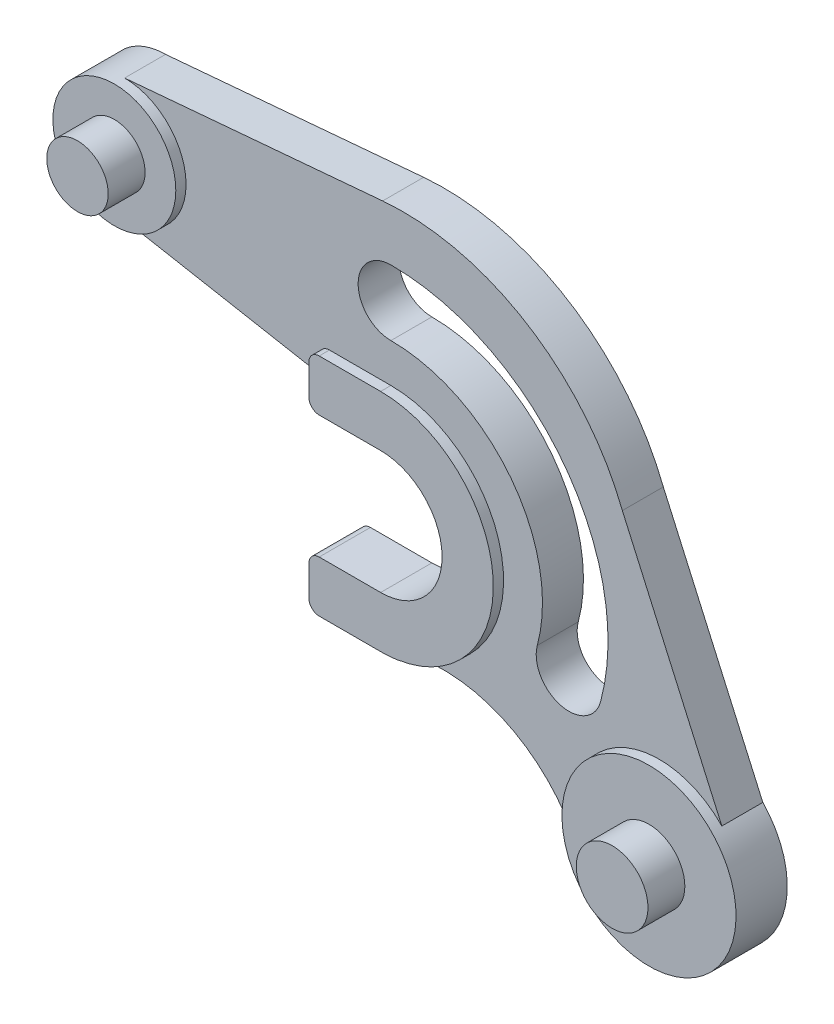
ISO-10303-21;
HEADER;
FILE_DESCRIPTION(('STEP AP214'),'2;1');
FILE_NAME('part.step','',(''),(''),'','','');
FILE_SCHEMA(('AUTOMOTIVE_DESIGN { 1 0 10303 214 1 1 1 1 }'));
ENDSEC;
DATA;
#1=APPLICATION_CONTEXT('core data for automotive mechanical design processes');
#2=APPLICATION_PROTOCOL_DEFINITION('international standard','automotive_design',2000,#1);
#3=PRODUCT_CONTEXT('',#1,'mechanical');
#4=PRODUCT('Part','Part','',(#3));
#5=PRODUCT_RELATED_PRODUCT_CATEGORY('part','',(#4));
#6=PRODUCT_DEFINITION_FORMATION('','',#4);
#7=PRODUCT_DEFINITION_CONTEXT('part definition',#1,'design');
#8=PRODUCT_DEFINITION('design','',#6,#7);
#9=PRODUCT_DEFINITION_SHAPE('','',#8);
#10=(LENGTH_UNIT() NAMED_UNIT(*) SI_UNIT(.MILLI.,.METRE.));
#11=(NAMED_UNIT(*) PLANE_ANGLE_UNIT() SI_UNIT($,.RADIAN.));
#12=(NAMED_UNIT(*) SI_UNIT($,.STERADIAN.) SOLID_ANGLE_UNIT());
#13=UNCERTAINTY_MEASURE_WITH_UNIT(LENGTH_MEASURE(1.E-05),#10,'distance_accuracy_value','');
#14=(GEOMETRIC_REPRESENTATION_CONTEXT(3) GLOBAL_UNCERTAINTY_ASSIGNED_CONTEXT((#13)) GLOBAL_UNIT_ASSIGNED_CONTEXT((#10,
#11,#12)) REPRESENTATION_CONTEXT('',''));
#15=CARTESIAN_POINT('',(0.,0.,0.));
#16=DIRECTION('',(0.,0.,1.));
#17=DIRECTION('',(1.,0.,0.));
#18=AXIS2_PLACEMENT_3D('',#15,#16,#17);
#19=CARTESIAN_POINT('',(0.,90.,20.));
#20=DIRECTION('',(0.,0.,-1.));
#21=DIRECTION('',(-1.,0.,0.));
#22=AXIS2_PLACEMENT_3D('',#19,#20,#21);
#23=CYLINDRICAL_SURFACE('',#22,16.);
#24=CARTESIAN_POINT('',(0.,90.,0.));
#25=DIRECTION('',(0.,0.,1.));
#26=DIRECTION('',(1.,0.,0.));
#27=AXIS2_PLACEMENT_3D('',#24,#25,#26);
#28=CIRCLE('',#27,16.);
#29=CARTESIAN_POINT('',(0.,106.,0.));
#30=VERTEX_POINT('',#29);
#31=CARTESIAN_POINT('',(0.,74.,0.));
#32=VERTEX_POINT('',#31);
#33=EDGE_CURVE('E175',#30,#32,#28,.T.);
#34=ORIENTED_EDGE('',*,*,#33,.F.);
#35=DIRECTION('',(0.,0.,-1.));
#36=VECTOR('',#35,1.);
#37=CARTESIAN_POINT('',(0.,106.,20.));
#38=LINE('',#37,#36);
#39=CARTESIAN_POINT('',(0.,106.,20.));
#40=VERTEX_POINT('',#39);
#41=EDGE_CURVE('E11',#40,#30,#38,.T.);
#42=ORIENTED_EDGE('',*,*,#41,.F.);
#43=CARTESIAN_POINT('',(0.,90.,20.));
#44=DIRECTION('',(0.,0.,1.));
#45=DIRECTION('',(1.,0.,0.));
#46=AXIS2_PLACEMENT_3D('',#43,#44,#45);
#47=CIRCLE('',#46,16.);
#48=CARTESIAN_POINT('',(0.,74.,20.));
#49=VERTEX_POINT('',#48);
#50=EDGE_CURVE('E143',#40,#49,#47,.T.);
#51=ORIENTED_EDGE('',*,*,#50,.T.);
#52=DIRECTION('',(0.,0.,-1.));
#53=VECTOR('',#52,1.);
#54=CARTESIAN_POINT('',(0.,74.,20.));
#55=LINE('',#54,#53);
#56=EDGE_CURVE('E96',#49,#32,#55,.T.);
#57=ORIENTED_EDGE('',*,*,#56,.T.);
#58=EDGE_LOOP('',(#34,#42,#51,#57));
#59=FACE_BOUND('',#58,.T.);
#60=ADVANCED_FACE('F41',(#59),#23,.F.);
#61=CARTESIAN_POINT('',(0.,0.,20.));
#62=DIRECTION('',(0.,0.,-1.));
#63=DIRECTION('',(-1.,0.,0.));
#64=AXIS2_PLACEMENT_3D('',#61,#62,#63);
#65=CYLINDRICAL_SURFACE('',#64,106.);
#66=CARTESIAN_POINT('',(0.,0.,0.));
#67=DIRECTION('',(0.,0.,1.));
#68=DIRECTION('',(1.,0.,0.));
#69=AXIS2_PLACEMENT_3D('',#66,#67,#68);
#70=CIRCLE('',#69,106.);
#71=CARTESIAN_POINT('',(102.386743402509,-27.4400214181548,0.));
#72=VERTEX_POINT('',#71);
#73=EDGE_CURVE('E134',#72,#30,#70,.T.);
#74=ORIENTED_EDGE('',*,*,#73,.F.);
#75=DIRECTION('',(0.,0.,-1.));
#76=VECTOR('',#75,1.);
#77=CARTESIAN_POINT('',(102.386743402509,-27.4400214181548,20.));
#78=LINE('',#77,#76);
#79=CARTESIAN_POINT('',(102.386743402509,-27.4400214181548,20.));
#80=VERTEX_POINT('',#79);
#81=EDGE_CURVE('E52',#80,#72,#78,.T.);
#82=ORIENTED_EDGE('',*,*,#81,.F.);
#83=CARTESIAN_POINT('',(0.,0.,20.));
#84=DIRECTION('',(0.,0.,1.));
#85=DIRECTION('',(1.,0.,0.));
#86=AXIS2_PLACEMENT_3D('',#83,#84,#85);
#87=CIRCLE('',#86,106.);
#88=EDGE_CURVE('E132',#80,#40,#87,.T.);
#89=ORIENTED_EDGE('',*,*,#88,.T.);
#90=ORIENTED_EDGE('',*,*,#41,.T.);
#91=EDGE_LOOP('',(#74,#82,#89,#90));
#92=FACE_BOUND('',#91,.T.);
#93=ADVANCED_FACE('F131',(#92),#65,.F.);
#94=CARTESIAN_POINT('',(86.9321406247717,-23.298131392773,20.));
#95=DIRECTION('',(0.,0.,-1.));
#96=DIRECTION('',(-1.,0.,0.));
#97=AXIS2_PLACEMENT_3D('',#94,#95,#96);
#98=CYLINDRICAL_SURFACE('',#97,16.);
#99=CARTESIAN_POINT('',(86.9321406247717,-23.298131392773,0.));
#100=DIRECTION('',(0.,0.,1.));
#101=DIRECTION('',(1.,0.,0.));
#102=AXIS2_PLACEMENT_3D('',#99,#100,#101);
#103=CIRCLE('',#102,16.);
#104=CARTESIAN_POINT('',(71.4775378470345,-19.1562413673911,0.));
#105=VERTEX_POINT('',#104);
#106=EDGE_CURVE('E181',#105,#72,#103,.T.);
#107=ORIENTED_EDGE('',*,*,#106,.F.);
#108=DIRECTION('',(0.,0.,-1.));
#109=VECTOR('',#108,1.);
#110=CARTESIAN_POINT('',(71.4775378470345,-19.1562413673911,20.));
#111=LINE('',#110,#109);
#112=CARTESIAN_POINT('',(71.4775378470345,-19.1562413673911,20.));
#113=VERTEX_POINT('',#112);
#114=EDGE_CURVE('E89',#113,#105,#111,.T.);
#115=ORIENTED_EDGE('',*,*,#114,.F.);
#116=CARTESIAN_POINT('',(86.9321406247717,-23.298131392773,20.));
#117=DIRECTION('',(0.,0.,1.));
#118=DIRECTION('',(1.,0.,0.));
#119=AXIS2_PLACEMENT_3D('',#116,#117,#118);
#120=CIRCLE('',#119,16.);
#121=EDGE_CURVE('E142',#113,#80,#120,.T.);
#122=ORIENTED_EDGE('',*,*,#121,.T.);
#123=ORIENTED_EDGE('',*,*,#81,.T.);
#124=EDGE_LOOP('',(#107,#115,#122,#123));
#125=FACE_BOUND('',#124,.T.);
#126=ADVANCED_FACE('F146',(#125),#98,.F.);
#127=CARTESIAN_POINT('',(25.4217830189074,-124.309898693249,20.));
#128=DIRECTION('',(0.,0.,-1.));
#129=DIRECTION('',(-1.,0.,0.));
#130=AXIS2_PLACEMENT_3D('',#127,#128,#129);
#131=CYLINDRICAL_SURFACE('',#130,72.);
#132=CARTESIAN_POINT('',(25.4217830189074,-124.309898693249,0.));
#133=DIRECTION('',(0.,0.,1.));
#134=DIRECTION('',(1.,0.,0.));
#135=AXIS2_PLACEMENT_3D('',#132,#133,#134);
#136=CIRCLE('',#135,72.);
#137=CARTESIAN_POINT('',(8.35707200090222,-54.3613773516799,0.));
#138=VERTEX_POINT('',#137);
#139=CARTESIAN_POINT('',(91.8772702313844,-96.6030724702352,0.));
#140=VERTEX_POINT('',#139);
#141=EDGE_CURVE('E154',#138,#140,#136,.F.);
#142=ORIENTED_EDGE('',*,*,#141,.T.);
#143=DIRECTION('',(0.,0.,-1.));
#144=VECTOR('',#143,1.);
#145=CARTESIAN_POINT('',(91.8772702313844,-96.6030724702352,25.));
#146=LINE('',#145,#144);
#147=CARTESIAN_POINT('',(91.8772702313844,-96.6030724702352,25.));
#148=VERTEX_POINT('',#147);
#149=EDGE_CURVE('E299',#148,#140,#146,.T.);
#150=ORIENTED_EDGE('',*,*,#149,.F.);
#151=CARTESIAN_POINT('',(25.4217830189074,-124.309898693249,25.));
#152=DIRECTION('',(0.,0.,1.));
#153=DIRECTION('',(1.,0.,0.));
#154=AXIS2_PLACEMENT_3D('',#151,#152,#153);
#155=CIRCLE('',#154,72.);
#156=CARTESIAN_POINT('',(91.7461426252189,-96.2906317004694,25.));
#157=VERTEX_POINT('',#156);
#158=EDGE_CURVE('E316',#157,#148,#155,.F.);
#159=ORIENTED_EDGE('',*,*,#158,.F.);
#160=DIRECTION('',(0.,0.,-1.));
#161=VECTOR('',#160,1.);
#162=CARTESIAN_POINT('',(91.7461426252189,-96.2906317004694,25.));
#163=LINE('',#162,#161);
#164=CARTESIAN_POINT('',(91.7461426252189,-96.2906317004694,20.));
#165=VERTEX_POINT('',#164);
#166=EDGE_CURVE('E315',#157,#165,#163,.T.);
#167=ORIENTED_EDGE('',*,*,#166,.T.);
#168=CARTESIAN_POINT('',(25.4217830189074,-124.309898693249,20.));
#169=DIRECTION('',(0.,0.,1.));
#170=DIRECTION('',(1.,0.,0.));
#171=AXIS2_PLACEMENT_3D('',#168,#169,#170);
#172=CIRCLE('',#171,72.);
#173=CARTESIAN_POINT('',(13.6555001074386,-53.2778313824404,20.));
#174=VERTEX_POINT('',#173);
#175=EDGE_CURVE('E345',#174,#165,#172,.F.);
#176=ORIENTED_EDGE('',*,*,#175,.F.);
#177=DIRECTION('',(0.,0.,-1.));
#178=VECTOR('',#177,1.);
#179=CARTESIAN_POINT('',(13.6555001074386,-53.2778313824404,25.));
#180=LINE('',#179,#178);
#181=CARTESIAN_POINT('',(13.6555001074386,-53.2778313824404,25.));
#182=VERTEX_POINT('',#181);
#183=EDGE_CURVE('E364',#182,#174,#180,.T.);
#184=ORIENTED_EDGE('',*,*,#183,.F.);
#185=CARTESIAN_POINT('',(25.4217830189074,-124.309898693249,25.));
#186=DIRECTION('',(0.,0.,1.));
#187=DIRECTION('',(1.,0.,0.));
#188=AXIS2_PLACEMENT_3D('',#185,#186,#187);
#189=CIRCLE('',#188,72.);
#190=CARTESIAN_POINT('',(8.35707200090222,-54.3613773516799,25.));
#191=VERTEX_POINT('',#190);
#192=EDGE_CURVE('E378',#191,#182,#189,.F.);
#193=ORIENTED_EDGE('',*,*,#192,.F.);
#194=DIRECTION('',(0.,0.,-1.));
#195=VECTOR('',#194,1.);
#196=CARTESIAN_POINT('',(8.35707200090222,-54.3613773516799,25.));
#197=LINE('',#196,#195);
#198=EDGE_CURVE('E304',#191,#138,#197,.T.);
#199=ORIENTED_EDGE('',*,*,#198,.T.);
#200=EDGE_LOOP('',(#142,#150,#159,#167,#176,#184,#193,#199));
#201=FACE_BOUND('',#200,.T.);
#202=ADVANCED_FACE('F43',(#201),#131,.F.);
#203=CARTESIAN_POINT('',(116.083477945521,51.6836942717257,20.));
#204=DIRECTION('',(0.913545457642605,0.406736643075792,0.));
#205=DIRECTION('',(-0.406736643075792,0.913545457642605,0.));
#206=AXIS2_PLACEMENT_3D('',#203,#204,#205);
#207=PLANE('',#206);
#208=DIRECTION('',(0.406736643075792,-0.913545457642605,0.));
#209=VECTOR('',#208,1.);
#210=CARTESIAN_POINT('',(116.083477945521,51.6836942717257,0.));
#211=LINE('',#210,#209);
#212=CARTESIAN_POINT('',(112.99328610824,58.6243787766777,0.));
#213=VERTEX_POINT('',#212);
#214=CARTESIAN_POINT('',(161.565293977531,-50.4701370801163,0.));
#215=VERTEX_POINT('',#214);
#216=EDGE_CURVE('E158',#213,#215,#211,.T.);
#217=ORIENTED_EDGE('',*,*,#216,.F.);
#218=DIRECTION('',(0.,0.,-1.));
#219=VECTOR('',#218,1.);
#220=CARTESIAN_POINT('',(112.99328610824,58.6243787766777,20.));
#221=LINE('',#220,#219);
#222=CARTESIAN_POINT('',(112.99328610824,58.6243787766777,20.));
#223=VERTEX_POINT('',#222);
#224=EDGE_CURVE('E204',#223,#213,#221,.T.);
#225=ORIENTED_EDGE('',*,*,#224,.F.);
#226=DIRECTION('',(0.406736643075792,-0.913545457642605,0.));
#227=VECTOR('',#226,1.);
#228=CARTESIAN_POINT('',(116.083477945521,51.6836942717257,20.));
#229=LINE('',#228,#227);
#230=CARTESIAN_POINT('',(161.565293977531,-50.4701370801163,20.));
#231=VERTEX_POINT('',#230);
#232=EDGE_CURVE('E219',#223,#231,#229,.T.);
#233=ORIENTED_EDGE('',*,*,#232,.T.);
#234=DIRECTION('',(0.,0.,-1.));
#235=VECTOR('',#234,1.);
#236=CARTESIAN_POINT('',(161.565293977531,-50.4701370801163,20.));
#237=LINE('',#236,#235);
#238=EDGE_CURVE('E45',#231,#215,#237,.T.);
#239=ORIENTED_EDGE('',*,*,#238,.T.);
#240=EDGE_LOOP('',(#217,#225,#233,#239));
#241=FACE_BOUND('',#240,.T.);
#242=ADVANCED_FACE('F216',(#241),#207,.T.);
#243=CARTESIAN_POINT('',(6.00211201037575,16.459361699005,20.));
#244=DIRECTION('',(0.,0.,-1.));
#245=DIRECTION('',(-1.,0.,0.));
#246=AXIS2_PLACEMENT_3D('',#243,#244,#245);
#247=CYLINDRICAL_SURFACE('',#246,115.);
#248=CARTESIAN_POINT('',(6.00211201037575,16.459361699005,0.));
#249=DIRECTION('',(0.,0.,1.));
#250=DIRECTION('',(1.,0.,0.));
#251=AXIS2_PLACEMENT_3D('',#248,#249,#250);
#252=CIRCLE('',#251,115.);
#253=CARTESIAN_POINT('',(-4.0207984056042,131.021751979556,0.));
#254=VERTEX_POINT('',#253);
#255=EDGE_CURVE('E163',#254,#213,#252,.F.);
#256=ORIENTED_EDGE('',*,*,#255,.F.);
#257=DIRECTION('',(0.,0.,-1.));
#258=VECTOR('',#257,1.);
#259=CARTESIAN_POINT('',(-4.0207984056042,131.021751979556,20.));
#260=LINE('',#259,#258);
#261=CARTESIAN_POINT('',(-4.0207984056042,131.021751979556,20.));
#262=VERTEX_POINT('',#261);
#263=EDGE_CURVE('E202',#262,#254,#260,.T.);
#264=ORIENTED_EDGE('',*,*,#263,.F.);
#265=CARTESIAN_POINT('',(6.00211201037575,16.459361699005,20.));
#266=DIRECTION('',(0.,0.,1.));
#267=DIRECTION('',(1.,0.,0.));
#268=AXIS2_PLACEMENT_3D('',#265,#266,#267);
#269=CIRCLE('',#268,115.);
#270=EDGE_CURVE('E237',#262,#223,#269,.F.);
#271=ORIENTED_EDGE('',*,*,#270,.T.);
#272=ORIENTED_EDGE('',*,*,#224,.T.);
#273=EDGE_LOOP('',(#256,#264,#271,#272));
#274=FACE_BOUND('',#273,.T.);
#275=ADVANCED_FACE('F235',(#274),#247,.T.);
#276=CARTESIAN_POINT('',(-11.4063867142214,130.375596729082,20.));
#277=DIRECTION('',(-0.0871557427476516,0.996194698091746,0.));
#278=DIRECTION('',(-0.996194698091746,-0.0871557427476516,0.));
#279=AXIS2_PLACEMENT_3D('',#276,#277,#278);
#280=PLANE('',#279);
#281=DIRECTION('',(0.996194698091746,0.0871557427476516,0.));
#282=VECTOR('',#281,1.);
#283=CARTESIAN_POINT('',(-11.4063867142214,130.375596729082,0.));
#284=LINE('',#283,#282);
#285=CARTESIAN_POINT('',(-130.,120.,0.));
#286=VERTEX_POINT('',#285);
#287=EDGE_CURVE('E167',#286,#254,#284,.T.);
#288=ORIENTED_EDGE('',*,*,#287,.F.);
#289=DIRECTION('',(0.,0.,-1.));
#290=VECTOR('',#289,1.);
#291=CARTESIAN_POINT('',(-130.,120.,20.));
#292=LINE('',#291,#290);
#293=CARTESIAN_POINT('',(-130.,120.,20.));
#294=VERTEX_POINT('',#293);
#295=EDGE_CURVE('E198',#294,#286,#292,.T.);
#296=ORIENTED_EDGE('',*,*,#295,.F.);
#297=DIRECTION('',(0.996194698091746,0.0871557427476516,0.));
#298=VECTOR('',#297,1.);
#299=CARTESIAN_POINT('',(-11.4063867142214,130.375596729082,20.));
#300=LINE('',#299,#298);
#301=EDGE_CURVE('E243',#294,#262,#300,.T.);
#302=ORIENTED_EDGE('',*,*,#301,.T.);
#303=ORIENTED_EDGE('',*,*,#263,.T.);
#304=EDGE_LOOP('',(#288,#296,#302,#303));
#305=FACE_BOUND('',#304,.T.);
#306=ADVANCED_FACE('F247',(#305),#280,.T.);
#307=CARTESIAN_POINT('',(6.42330877427997,34.8693904889484,20.));
#308=DIRECTION('',(-0.181162429476934,-0.983453188589073,0.));
#309=DIRECTION('',(0.983453188589073,-0.181162429476934,0.));
#310=AXIS2_PLACEMENT_3D('',#307,#308,#309);
#311=PLANE('',#310);
#312=DIRECTION('',(-0.983453188589073,0.181162429476934,0.));
#313=VECTOR('',#312,1.);
#314=CARTESIAN_POINT('',(6.42330877427997,34.8693904889484,0.));
#315=LINE('',#314,#313);
#316=CARTESIAN_POINT('',(-35.,42.5,0.));
#317=VERTEX_POINT('',#316);
#318=CARTESIAN_POINT('',(-130.,60.,0.));
#319=VERTEX_POINT('',#318);
#320=EDGE_CURVE('E171',#317,#319,#315,.T.);
#321=ORIENTED_EDGE('',*,*,#320,.F.);
#322=DIRECTION('',(0.,0.,-1.));
#323=VECTOR('',#322,1.);
#324=CARTESIAN_POINT('',(-35.,42.5,20.));
#325=LINE('',#324,#323);
#326=CARTESIAN_POINT('',(-35.,42.5,20.));
#327=VERTEX_POINT('',#326);
#328=EDGE_CURVE('E150',#327,#317,#325,.T.);
#329=ORIENTED_EDGE('',*,*,#328,.F.);
#330=DIRECTION('',(-0.983453188589073,0.181162429476934,0.));
#331=VECTOR('',#330,1.);
#332=CARTESIAN_POINT('',(6.42330877427997,34.8693904889484,20.));
#333=LINE('',#332,#331);
#334=CARTESIAN_POINT('',(-130.,60.,20.));
#335=VERTEX_POINT('',#334);
#336=EDGE_CURVE('E253',#327,#335,#333,.T.);
#337=ORIENTED_EDGE('',*,*,#336,.T.);
#338=DIRECTION('',(0.,0.,-1.));
#339=VECTOR('',#338,1.);
#340=CARTESIAN_POINT('',(-130.,60.,20.));
#341=LINE('',#340,#339);
#342=EDGE_CURVE('E194',#335,#319,#341,.T.);
#343=ORIENTED_EDGE('',*,*,#342,.T.);
#344=EDGE_LOOP('',(#321,#329,#337,#343));
#345=FACE_BOUND('',#344,.T.);
#346=ADVANCED_FACE('F265',(#345),#311,.T.);
#347=CARTESIAN_POINT('',(0.,0.,20.));
#348=DIRECTION('',(0.,0.,-1.));
#349=DIRECTION('',(-1.,0.,0.));
#350=AXIS2_PLACEMENT_3D('',#347,#348,#349);
#351=CYLINDRICAL_SURFACE('',#350,74.);
#352=CARTESIAN_POINT('',(0.,0.,0.));
#353=DIRECTION('',(0.,0.,1.));
#354=DIRECTION('',(1.,0.,0.));
#355=AXIS2_PLACEMENT_3D('',#352,#353,#354);
#356=CIRCLE('',#355,74.);
#357=EDGE_CURVE('E184',#105,#32,#356,.T.);
#358=ORIENTED_EDGE('',*,*,#357,.T.);
#359=ORIENTED_EDGE('',*,*,#56,.F.);
#360=CARTESIAN_POINT('',(0.,0.,20.));
#361=DIRECTION('',(0.,0.,1.));
#362=DIRECTION('',(1.,0.,0.));
#363=AXIS2_PLACEMENT_3D('',#360,#361,#362);
#364=CIRCLE('',#363,74.);
#365=EDGE_CURVE('E61',#113,#49,#364,.T.);
#366=ORIENTED_EDGE('',*,*,#365,.F.);
#367=ORIENTED_EDGE('',*,*,#114,.T.);
#368=EDGE_LOOP('',(#358,#359,#366,#367));
#369=FACE_BOUND('',#368,.T.);
#370=ADVANCED_FACE('F263',(#369),#351,.T.);
#371=CARTESIAN_POINT('',(0.,0.,20.));
#372=DIRECTION('',(0.,0.,1.));
#373=DIRECTION('',(1.,0.,0.));
#374=AXIS2_PLACEMENT_3D('',#371,#372,#373);
#375=PLANE('',#374);
#376=CARTESIAN_POINT('',(-30.,50.,20.));
#377=DIRECTION('',(0.,0.,1.));
#378=DIRECTION('',(1.,0.,0.));
#379=AXIS2_PLACEMENT_3D('',#376,#377,#378);
#380=CIRCLE('',#379,5.);
#381=CARTESIAN_POINT('',(-30.,55.,20.));
#382=VERTEX_POINT('',#381);
#383=CARTESIAN_POINT('',(-35.,50.,20.));
#384=VERTEX_POINT('',#383);
#385=EDGE_CURVE('E104',#382,#384,#380,.T.);
#386=ORIENTED_EDGE('',*,*,#385,.F.);
#387=DIRECTION('',(1.,0.,0.));
#388=VECTOR('',#387,1.);
#389=CARTESIAN_POINT('',(0.,55.,20.));
#390=LINE('',#389,#388);
#391=CARTESIAN_POINT('',(0.,55.,20.));
#392=VERTEX_POINT('',#391);
#393=EDGE_CURVE('E339',#382,#392,#390,.T.);
#394=ORIENTED_EDGE('',*,*,#393,.T.);
#395=CARTESIAN_POINT('',(0.,0.,20.));
#396=DIRECTION('',(0.,0.,1.));
#397=DIRECTION('',(1.,0.,0.));
#398=AXIS2_PLACEMENT_3D('',#395,#396,#397);
#399=CIRCLE('',#398,55.);
#400=EDGE_CURVE('E342',#392,#174,#399,.F.);
#401=ORIENTED_EDGE('',*,*,#400,.T.);
#402=ORIENTED_EDGE('',*,*,#175,.T.);
#403=CARTESIAN_POINT('',(131.,-80.,20.));
#404=DIRECTION('',(0.,0.,1.));
#405=DIRECTION('',(1.,0.,0.));
#406=AXIS2_PLACEMENT_3D('',#403,#404,#405);
#407=CIRCLE('',#406,42.5);
#408=EDGE_CURVE('E349',#231,#165,#407,.T.);
#409=ORIENTED_EDGE('',*,*,#408,.F.);
#410=ORIENTED_EDGE('',*,*,#232,.F.);
#411=ORIENTED_EDGE('',*,*,#270,.F.);
#412=ORIENTED_EDGE('',*,*,#301,.F.);
#413=CARTESIAN_POINT('',(-130.,90.,20.));
#414=DIRECTION('',(0.,0.,1.));
#415=DIRECTION('',(1.,0.,0.));
#416=AXIS2_PLACEMENT_3D('',#413,#414,#415);
#417=CIRCLE('',#416,30.);
#418=EDGE_CURVE('E249',#335,#294,#417,.T.);
#419=ORIENTED_EDGE('',*,*,#418,.F.);
#420=ORIENTED_EDGE('',*,*,#336,.F.);
#421=DIRECTION('',(0.,1.,0.));
#422=VECTOR('',#421,1.);
#423=CARTESIAN_POINT('',(-35.,0.,20.));
#424=LINE('',#423,#422);
#425=EDGE_CURVE('E260',#327,#384,#424,.T.);
#426=ORIENTED_EDGE('',*,*,#425,.T.);
#427=EDGE_LOOP('',(#386,#394,#401,#402,#409,#410,#411,#412,#419,#420,#426));
#428=FACE_BOUND('',#427,.T.);
#429=ORIENTED_EDGE('',*,*,#50,.F.);
#430=ORIENTED_EDGE('',*,*,#88,.F.);
#431=ORIENTED_EDGE('',*,*,#121,.F.);
#432=ORIENTED_EDGE('',*,*,#365,.T.);
#433=EDGE_LOOP('',(#429,#430,#431,#432));
#434=FACE_BOUND('',#433,.T.);
#435=ADVANCED_FACE('F141',(#428,#434),#375,.T.);
#436=CARTESIAN_POINT('',(0.,0.,0.));
#437=DIRECTION('',(0.,0.,1.));
#438=DIRECTION('',(1.,0.,0.));
#439=AXIS2_PLACEMENT_3D('',#436,#437,#438);
#440=PLANE('',#439);
#441=DIRECTION('',(0.,1.,0.));
#442=VECTOR('',#441,1.);
#443=CARTESIAN_POINT('',(-35.,0.,0.));
#444=LINE('',#443,#442);
#445=CARTESIAN_POINT('',(-35.,35.,0.));
#446=VERTEX_POINT('',#445);
#447=EDGE_CURVE('E455',#446,#317,#444,.T.);
#448=ORIENTED_EDGE('',*,*,#447,.T.);
#449=ORIENTED_EDGE('',*,*,#320,.T.);
#450=CARTESIAN_POINT('',(-130.,90.,0.));
#451=DIRECTION('',(0.,0.,1.));
#452=DIRECTION('',(1.,0.,0.));
#453=AXIS2_PLACEMENT_3D('',#450,#451,#452);
#454=CIRCLE('',#453,30.);
#455=EDGE_CURVE('E321',#286,#319,#454,.T.);
#456=ORIENTED_EDGE('',*,*,#455,.F.);
#457=ORIENTED_EDGE('',*,*,#287,.T.);
#458=ORIENTED_EDGE('',*,*,#255,.T.);
#459=ORIENTED_EDGE('',*,*,#216,.T.);
#460=CARTESIAN_POINT('',(131.,-80.,0.));
#461=DIRECTION('',(0.,0.,1.));
#462=DIRECTION('',(1.,0.,0.));
#463=AXIS2_PLACEMENT_3D('',#460,#461,#462);
#464=CIRCLE('',#463,42.5);
#465=EDGE_CURVE('E233',#140,#215,#464,.T.);
#466=ORIENTED_EDGE('',*,*,#465,.F.);
#467=ORIENTED_EDGE('',*,*,#141,.F.);
#468=CARTESIAN_POINT('',(0.,0.,0.));
#469=DIRECTION('',(0.,0.,1.));
#470=DIRECTION('',(1.,0.,0.));
#471=AXIS2_PLACEMENT_3D('',#468,#469,#470);
#472=CIRCLE('',#471,55.);
#473=CARTESIAN_POINT('',(0.,-55.,0.));
#474=VERTEX_POINT('',#473);
#475=EDGE_CURVE('E382',#138,#474,#472,.F.);
#476=ORIENTED_EDGE('',*,*,#475,.T.);
#477=DIRECTION('',(-1.,0.,0.));
#478=VECTOR('',#477,1.);
#479=CARTESIAN_POINT('',(0.,-55.,0.));
#480=LINE('',#479,#478);
#481=CARTESIAN_POINT('',(-29.9999999999999,-55.,0.));
#482=VERTEX_POINT('',#481);
#483=EDGE_CURVE('E494',#474,#482,#480,.T.);
#484=ORIENTED_EDGE('',*,*,#483,.T.);
#485=CARTESIAN_POINT('',(-30.,-50.,0.));
#486=DIRECTION('',(0.,0.,1.));
#487=DIRECTION('',(1.,0.,0.));
#488=AXIS2_PLACEMENT_3D('',#485,#486,#487);
#489=CIRCLE('',#488,5.);
#490=CARTESIAN_POINT('',(-35.,-50.,0.));
#491=VERTEX_POINT('',#490);
#492=EDGE_CURVE('E491',#491,#482,#489,.T.);
#493=ORIENTED_EDGE('',*,*,#492,.F.);
#494=DIRECTION('',(0.,-1.,0.));
#495=VECTOR('',#494,1.);
#496=CARTESIAN_POINT('',(-35.,0.,0.));
#497=LINE('',#496,#495);
#498=CARTESIAN_POINT('',(-35.,-35.,0.));
#499=VERTEX_POINT('',#498);
#500=EDGE_CURVE('E487',#499,#491,#497,.T.);
#501=ORIENTED_EDGE('',*,*,#500,.F.);
#502=CARTESIAN_POINT('',(-30.,-35.,0.));
#503=DIRECTION('',(0.,0.,1.));
#504=DIRECTION('',(1.,0.,0.));
#505=AXIS2_PLACEMENT_3D('',#502,#503,#504);
#506=CIRCLE('',#505,5.);
#507=CARTESIAN_POINT('',(-29.9999999999999,-30.,0.));
#508=VERTEX_POINT('',#507);
#509=EDGE_CURVE('E483',#508,#499,#506,.T.);
#510=ORIENTED_EDGE('',*,*,#509,.F.);
#511=DIRECTION('',(-1.,0.,0.));
#512=VECTOR('',#511,1.);
#513=CARTESIAN_POINT('',(0.,-30.,0.));
#514=LINE('',#513,#512);
#515=CARTESIAN_POINT('',(0.,-30.,0.));
#516=VERTEX_POINT('',#515);
#517=EDGE_CURVE('E479',#516,#508,#514,.T.);
#518=ORIENTED_EDGE('',*,*,#517,.F.);
#519=CARTESIAN_POINT('',(0.,0.,0.));
#520=DIRECTION('',(0.,0.,1.));
#521=DIRECTION('',(1.,0.,0.));
#522=AXIS2_PLACEMENT_3D('',#519,#520,#521);
#523=CIRCLE('',#522,30.);
#524=CARTESIAN_POINT('',(0.,30.,0.));
#525=VERTEX_POINT('',#524);
#526=EDGE_CURVE('E475',#525,#516,#523,.F.);
#527=ORIENTED_EDGE('',*,*,#526,.F.);
#528=DIRECTION('',(1.,0.,0.));
#529=VECTOR('',#528,1.);
#530=CARTESIAN_POINT('',(0.,30.,0.));
#531=LINE('',#530,#529);
#532=CARTESIAN_POINT('',(-30.,30.,0.));
#533=VERTEX_POINT('',#532);
#534=EDGE_CURVE('E465',#533,#525,#531,.T.);
#535=ORIENTED_EDGE('',*,*,#534,.F.);
#536=CARTESIAN_POINT('',(-30.,35.,0.));
#537=DIRECTION('',(0.,0.,1.));
#538=DIRECTION('',(1.,0.,0.));
#539=AXIS2_PLACEMENT_3D('',#536,#537,#538);
#540=CIRCLE('',#539,5.);
#541=EDGE_CURVE('E459',#533,#446,#540,.F.);
#542=ORIENTED_EDGE('',*,*,#541,.T.);
#543=EDGE_LOOP('',(#448,#449,#456,#457,#458,#459,#466,#467,#476,#484,#493,#501,#510,#518,#527,
#535,#542));
#544=FACE_BOUND('',#543,.T.);
#545=ORIENTED_EDGE('',*,*,#33,.T.);
#546=ORIENTED_EDGE('',*,*,#357,.F.);
#547=ORIENTED_EDGE('',*,*,#106,.T.);
#548=ORIENTED_EDGE('',*,*,#73,.T.);
#549=EDGE_LOOP('',(#545,#546,#547,#548));
#550=FACE_BOUND('',#549,.T.);
#551=ADVANCED_FACE('F229',(#544,#550),#440,.F.);
#552=CARTESIAN_POINT('',(-130.,90.,25.));
#553=DIRECTION('',(0.,0.,-1.));
#554=DIRECTION('',(-1.,0.,0.));
#555=AXIS2_PLACEMENT_3D('',#552,#553,#554);
#556=CYLINDRICAL_SURFACE('',#555,30.);
#557=ORIENTED_EDGE('',*,*,#295,.T.);
#558=ORIENTED_EDGE('',*,*,#455,.T.);
#559=ORIENTED_EDGE('',*,*,#342,.F.);
#560=ORIENTED_EDGE('',*,*,#418,.T.);
#561=EDGE_LOOP('',(#557,#558,#559,#560));
#562=FACE_BOUND('',#561,.T.);
#563=CARTESIAN_POINT('',(-130.,90.,25.));
#564=DIRECTION('',(0.,0.,1.));
#565=DIRECTION('',(1.,0.,0.));
#566=AXIS2_PLACEMENT_3D('',#563,#564,#565);
#567=CIRCLE('',#566,30.);
#568=CARTESIAN_POINT('',(-100.,90.,25.));
#569=VERTEX_POINT('',#568);
#570=EDGE_CURVE('E159',#569,#569,#567,.T.);
#571=ORIENTED_EDGE('',*,*,#570,.F.);
#572=EDGE_LOOP('',(#571));
#573=FACE_BOUND('',#572,.T.);
#574=ADVANCED_FACE('F446',(#562,#573),#556,.T.);
#575=CARTESIAN_POINT('',(0.,0.,25.));
#576=DIRECTION('',(0.,0.,1.));
#577=DIRECTION('',(1.,0.,0.));
#578=AXIS2_PLACEMENT_3D('',#575,#576,#577);
#579=PLANE('',#578);
#580=CARTESIAN_POINT('',(-130.,90.,25.));
#581=DIRECTION('',(0.,0.,1.));
#582=DIRECTION('',(1.,0.,0.));
#583=AXIS2_PLACEMENT_3D('',#580,#581,#582);
#584=CIRCLE('',#583,15.);
#585=CARTESIAN_POINT('',(-115.,90.,25.));
#586=VERTEX_POINT('',#585);
#587=EDGE_CURVE('E327',#586,#586,#584,.T.);
#588=ORIENTED_EDGE('',*,*,#587,.F.);
#589=EDGE_LOOP('',(#588));
#590=FACE_BOUND('',#589,.T.);
#591=ORIENTED_EDGE('',*,*,#570,.T.);
#592=EDGE_LOOP('',(#591));
#593=FACE_BOUND('',#592,.T.);
#594=ADVANCED_FACE('F654',(#590,#593),#579,.T.);
#595=CARTESIAN_POINT('',(131.,-80.,25.));
#596=DIRECTION('',(0.,0.,-1.));
#597=DIRECTION('',(-1.,0.,0.));
#598=AXIS2_PLACEMENT_3D('',#595,#596,#597);
#599=CYLINDRICAL_SURFACE('',#598,42.5);
#600=ORIENTED_EDGE('',*,*,#238,.F.);
#601=ORIENTED_EDGE('',*,*,#408,.T.);
#602=ORIENTED_EDGE('',*,*,#166,.F.);
#603=CARTESIAN_POINT('',(131.,-80.,25.));
#604=DIRECTION('',(0.,0.,1.));
#605=DIRECTION('',(1.,0.,0.));
#606=AXIS2_PLACEMENT_3D('',#603,#604,#605);
#607=CIRCLE('',#606,42.5);
#608=EDGE_CURVE('E313',#148,#157,#607,.T.);
#609=ORIENTED_EDGE('',*,*,#608,.F.);
#610=ORIENTED_EDGE('',*,*,#149,.T.);
#611=ORIENTED_EDGE('',*,*,#465,.T.);
#612=EDGE_LOOP('',(#600,#601,#602,#609,#610,#611));
#613=FACE_BOUND('',#612,.T.);
#614=ADVANCED_FACE('F310',(#613),#599,.T.);
#615=CARTESIAN_POINT('',(0.,0.,25.));
#616=DIRECTION('',(0.,0.,1.));
#617=DIRECTION('',(1.,0.,0.));
#618=AXIS2_PLACEMENT_3D('',#615,#616,#617);
#619=PLANE('',#618);
#620=CARTESIAN_POINT('',(131.,-80.,25.));
#621=DIRECTION('',(0.,0.,1.));
#622=DIRECTION('',(1.,0.,0.));
#623=AXIS2_PLACEMENT_3D('',#620,#621,#622);
#624=CIRCLE('',#623,17.5);
#625=CARTESIAN_POINT('',(148.5,-80.,25.));
#626=VERTEX_POINT('',#625);
#627=EDGE_CURVE('E430',#626,#626,#624,.T.);
#628=ORIENTED_EDGE('',*,*,#627,.F.);
#629=EDGE_LOOP('',(#628));
#630=FACE_BOUND('',#629,.T.);
#631=ORIENTED_EDGE('',*,*,#608,.T.);
#632=ORIENTED_EDGE('',*,*,#158,.T.);
#633=EDGE_LOOP('',(#631,#632));
#634=FACE_BOUND('',#633,.T.);
#635=ADVANCED_FACE('F436',(#630,#634),#619,.T.);
#636=CARTESIAN_POINT('',(0.,55.,25.));
#637=DIRECTION('',(0.,1.,0.));
#638=DIRECTION('',(0.,0.,1.));
#639=AXIS2_PLACEMENT_3D('',#636,#637,#638);
#640=PLANE('',#639);
#641=DIRECTION('',(0.,0.,-1.));
#642=VECTOR('',#641,1.);
#643=CARTESIAN_POINT('',(0.,55.,25.));
#644=LINE('',#643,#642);
#645=CARTESIAN_POINT('',(0.,55.,25.));
#646=VERTEX_POINT('',#645);
#647=EDGE_CURVE('E362',#646,#392,#644,.T.);
#648=ORIENTED_EDGE('',*,*,#647,.T.);
#649=ORIENTED_EDGE('',*,*,#393,.F.);
#650=DIRECTION('',(0.,0.,-1.));
#651=VECTOR('',#650,1.);
#652=CARTESIAN_POINT('',(-30.,55.,25.));
#653=LINE('',#652,#651);
#654=CARTESIAN_POINT('',(-30.,55.,25.));
#655=VERTEX_POINT('',#654);
#656=EDGE_CURVE('E427',#655,#382,#653,.T.);
#657=ORIENTED_EDGE('',*,*,#656,.F.);
#658=DIRECTION('',(1.,0.,0.));
#659=VECTOR('',#658,1.);
#660=CARTESIAN_POINT('',(0.,55.,25.));
#661=LINE('',#660,#659);
#662=EDGE_CURVE('E370',#655,#646,#661,.T.);
#663=ORIENTED_EDGE('',*,*,#662,.T.);
#664=EDGE_LOOP('',(#648,#649,#657,#663));
#665=FACE_BOUND('',#664,.T.);
#666=ADVANCED_FACE('F366',(#665),#640,.T.);
#667=CARTESIAN_POINT('',(-30.,50.,25.));
#668=DIRECTION('',(0.,0.,-1.));
#669=DIRECTION('',(-1.,0.,0.));
#670=AXIS2_PLACEMENT_3D('',#667,#668,#669);
#671=CYLINDRICAL_SURFACE('',#670,5.);
#672=ORIENTED_EDGE('',*,*,#385,.T.);
#673=DIRECTION('',(0.,0.,-1.));
#674=VECTOR('',#673,1.);
#675=CARTESIAN_POINT('',(-35.,50.,25.));
#676=LINE('',#675,#674);
#677=CARTESIAN_POINT('',(-35.,50.,25.));
#678=VERTEX_POINT('',#677);
#679=EDGE_CURVE('E423',#678,#384,#676,.T.);
#680=ORIENTED_EDGE('',*,*,#679,.F.);
#681=CARTESIAN_POINT('',(-30.,50.,25.));
#682=DIRECTION('',(0.,0.,1.));
#683=DIRECTION('',(1.,0.,0.));
#684=AXIS2_PLACEMENT_3D('',#681,#682,#683);
#685=CIRCLE('',#684,5.);
#686=EDGE_CURVE('E503',#655,#678,#685,.T.);
#687=ORIENTED_EDGE('',*,*,#686,.F.);
#688=ORIENTED_EDGE('',*,*,#656,.T.);
#689=EDGE_LOOP('',(#672,#680,#687,#688));
#690=FACE_BOUND('',#689,.T.);
#691=ADVANCED_FACE('F643',(#690),#671,.T.);
#692=CARTESIAN_POINT('',(-35.,0.,25.));
#693=DIRECTION('',(-1.,0.,0.));
#694=DIRECTION('',(0.,-1.,0.));
#695=AXIS2_PLACEMENT_3D('',#692,#693,#694);
#696=PLANE('',#695);
#697=ORIENTED_EDGE('',*,*,#425,.F.);
#698=ORIENTED_EDGE('',*,*,#328,.T.);
#699=ORIENTED_EDGE('',*,*,#447,.F.);
#700=DIRECTION('',(0.,0.,-1.));
#701=VECTOR('',#700,1.);
#702=CARTESIAN_POINT('',(-35.,35.,25.));
#703=LINE('',#702,#701);
#704=CARTESIAN_POINT('',(-35.,35.,25.));
#705=VERTEX_POINT('',#704);
#706=EDGE_CURVE('E419',#705,#446,#703,.T.);
#707=ORIENTED_EDGE('',*,*,#706,.F.);
#708=DIRECTION('',(0.,1.,0.));
#709=VECTOR('',#708,1.);
#710=CARTESIAN_POINT('',(-35.,0.,25.));
#711=LINE('',#710,#709);
#712=EDGE_CURVE('E507',#705,#678,#711,.T.);
#713=ORIENTED_EDGE('',*,*,#712,.T.);
#714=ORIENTED_EDGE('',*,*,#679,.T.);
#715=EDGE_LOOP('',(#697,#698,#699,#707,#713,#714));
#716=FACE_BOUND('',#715,.T.);
#717=ADVANCED_FACE('F452',(#716),#696,.T.);
#718=CARTESIAN_POINT('',(-30.,35.,25.));
#719=DIRECTION('',(0.,0.,-1.));
#720=DIRECTION('',(-1.,0.,0.));
#721=AXIS2_PLACEMENT_3D('',#718,#719,#720);
#722=CYLINDRICAL_SURFACE('',#721,5.);
#723=ORIENTED_EDGE('',*,*,#541,.F.);
#724=DIRECTION('',(0.,0.,-1.));
#725=VECTOR('',#724,1.);
#726=CARTESIAN_POINT('',(-30.,30.,25.));
#727=LINE('',#726,#725);
#728=CARTESIAN_POINT('',(-30.,30.,25.));
#729=VERTEX_POINT('',#728);
#730=EDGE_CURVE('E415',#729,#533,#727,.T.);
#731=ORIENTED_EDGE('',*,*,#730,.F.);
#732=CARTESIAN_POINT('',(-30.,35.,25.));
#733=DIRECTION('',(0.,0.,1.));
#734=DIRECTION('',(1.,0.,0.));
#735=AXIS2_PLACEMENT_3D('',#732,#733,#734);
#736=CIRCLE('',#735,5.);
#737=EDGE_CURVE('E514',#729,#705,#736,.F.);
#738=ORIENTED_EDGE('',*,*,#737,.T.);
#739=ORIENTED_EDGE('',*,*,#706,.T.);
#740=EDGE_LOOP('',(#723,#731,#738,#739));
#741=FACE_BOUND('',#740,.T.);
#742=ADVANCED_FACE('F636',(#741),#722,.T.);
#743=CARTESIAN_POINT('',(0.,30.,25.));
#744=DIRECTION('',(0.,1.,0.));
#745=DIRECTION('',(0.,0.,1.));
#746=AXIS2_PLACEMENT_3D('',#743,#744,#745);
#747=PLANE('',#746);
#748=ORIENTED_EDGE('',*,*,#534,.T.);
#749=DIRECTION('',(0.,0.,-1.));
#750=VECTOR('',#749,1.);
#751=CARTESIAN_POINT('',(0.,30.,25.));
#752=LINE('',#751,#750);
#753=CARTESIAN_POINT('',(0.,30.,25.));
#754=VERTEX_POINT('',#753);
#755=EDGE_CURVE('E411',#754,#525,#752,.T.);
#756=ORIENTED_EDGE('',*,*,#755,.F.);
#757=DIRECTION('',(1.,0.,0.));
#758=VECTOR('',#757,1.);
#759=CARTESIAN_POINT('',(0.,30.,25.));
#760=LINE('',#759,#758);
#761=EDGE_CURVE('E518',#729,#754,#760,.T.);
#762=ORIENTED_EDGE('',*,*,#761,.F.);
#763=ORIENTED_EDGE('',*,*,#730,.T.);
#764=EDGE_LOOP('',(#748,#756,#762,#763));
#765=FACE_BOUND('',#764,.T.);
#766=ADVANCED_FACE('F632',(#765),#747,.F.);
#767=CARTESIAN_POINT('',(0.,0.,25.));
#768=DIRECTION('',(0.,0.,-1.));
#769=DIRECTION('',(-1.,0.,0.));
#770=AXIS2_PLACEMENT_3D('',#767,#768,#769);
#771=CYLINDRICAL_SURFACE('',#770,30.);
#772=ORIENTED_EDGE('',*,*,#526,.T.);
#773=DIRECTION('',(0.,0.,-1.));
#774=VECTOR('',#773,1.);
#775=CARTESIAN_POINT('',(0.,-30.,25.));
#776=LINE('',#775,#774);
#777=CARTESIAN_POINT('',(0.,-30.,25.));
#778=VERTEX_POINT('',#777);
#779=EDGE_CURVE('E407',#778,#516,#776,.T.);
#780=ORIENTED_EDGE('',*,*,#779,.F.);
#781=CARTESIAN_POINT('',(0.,0.,25.));
#782=DIRECTION('',(0.,0.,1.));
#783=DIRECTION('',(1.,0.,0.));
#784=AXIS2_PLACEMENT_3D('',#781,#782,#783);
#785=CIRCLE('',#784,30.);
#786=EDGE_CURVE('E522',#754,#778,#785,.F.);
#787=ORIENTED_EDGE('',*,*,#786,.F.);
#788=ORIENTED_EDGE('',*,*,#755,.T.);
#789=EDGE_LOOP('',(#772,#780,#787,#788));
#790=FACE_BOUND('',#789,.T.);
#791=ADVANCED_FACE('F628',(#790),#771,.F.);
#792=CARTESIAN_POINT('',(0.,-30.,25.));
#793=DIRECTION('',(0.,-1.,0.));
#794=DIRECTION('',(1.,0.,0.));
#795=AXIS2_PLACEMENT_3D('',#792,#793,#794);
#796=PLANE('',#795);
#797=ORIENTED_EDGE('',*,*,#517,.T.);
#798=DIRECTION('',(0.,0.,-1.));
#799=VECTOR('',#798,1.);
#800=CARTESIAN_POINT('',(-29.9999999999999,-30.,25.));
#801=LINE('',#800,#799);
#802=CARTESIAN_POINT('',(-29.9999999999999,-30.,25.));
#803=VERTEX_POINT('',#802);
#804=EDGE_CURVE('E403',#803,#508,#801,.T.);
#805=ORIENTED_EDGE('',*,*,#804,.F.);
#806=DIRECTION('',(-1.,0.,0.));
#807=VECTOR('',#806,1.);
#808=CARTESIAN_POINT('',(0.,-30.,25.));
#809=LINE('',#808,#807);
#810=EDGE_CURVE('E526',#778,#803,#809,.T.);
#811=ORIENTED_EDGE('',*,*,#810,.F.);
#812=ORIENTED_EDGE('',*,*,#779,.T.);
#813=EDGE_LOOP('',(#797,#805,#811,#812));
#814=FACE_BOUND('',#813,.T.);
#815=ADVANCED_FACE('F624',(#814),#796,.F.);
#816=CARTESIAN_POINT('',(-30.,-35.,25.));
#817=DIRECTION('',(0.,0.,-1.));
#818=DIRECTION('',(-1.,0.,0.));
#819=AXIS2_PLACEMENT_3D('',#816,#817,#818);
#820=CYLINDRICAL_SURFACE('',#819,5.);
#821=ORIENTED_EDGE('',*,*,#509,.T.);
#822=DIRECTION('',(0.,0.,-1.));
#823=VECTOR('',#822,1.);
#824=CARTESIAN_POINT('',(-35.,-35.,25.));
#825=LINE('',#824,#823);
#826=CARTESIAN_POINT('',(-35.,-35.,25.));
#827=VERTEX_POINT('',#826);
#828=EDGE_CURVE('E399',#827,#499,#825,.T.);
#829=ORIENTED_EDGE('',*,*,#828,.F.);
#830=CARTESIAN_POINT('',(-30.,-35.,25.));
#831=DIRECTION('',(0.,0.,1.));
#832=DIRECTION('',(1.,0.,0.));
#833=AXIS2_PLACEMENT_3D('',#830,#831,#832);
#834=CIRCLE('',#833,5.);
#835=EDGE_CURVE('E530',#803,#827,#834,.T.);
#836=ORIENTED_EDGE('',*,*,#835,.F.);
#837=ORIENTED_EDGE('',*,*,#804,.T.);
#838=EDGE_LOOP('',(#821,#829,#836,#837));
#839=FACE_BOUND('',#838,.T.);
#840=ADVANCED_FACE('F620',(#839),#820,.T.);
#841=CARTESIAN_POINT('',(-35.,0.,25.));
#842=DIRECTION('',(1.,0.,0.));
#843=DIRECTION('',(0.,1.,0.));
#844=AXIS2_PLACEMENT_3D('',#841,#842,#843);
#845=PLANE('',#844);
#846=ORIENTED_EDGE('',*,*,#500,.T.);
#847=DIRECTION('',(0.,0.,-1.));
#848=VECTOR('',#847,1.);
#849=CARTESIAN_POINT('',(-35.,-50.,25.));
#850=LINE('',#849,#848);
#851=CARTESIAN_POINT('',(-35.,-50.,25.));
#852=VERTEX_POINT('',#851);
#853=EDGE_CURVE('E395',#852,#491,#850,.T.);
#854=ORIENTED_EDGE('',*,*,#853,.F.);
#855=DIRECTION('',(0.,-1.,0.));
#856=VECTOR('',#855,1.);
#857=CARTESIAN_POINT('',(-35.,0.,25.));
#858=LINE('',#857,#856);
#859=EDGE_CURVE('E534',#827,#852,#858,.T.);
#860=ORIENTED_EDGE('',*,*,#859,.F.);
#861=ORIENTED_EDGE('',*,*,#828,.T.);
#862=EDGE_LOOP('',(#846,#854,#860,#861));
#863=FACE_BOUND('',#862,.T.);
#864=ADVANCED_FACE('F614',(#863),#845,.F.);
#865=CARTESIAN_POINT('',(-30.,-50.,25.));
#866=DIRECTION('',(0.,0.,-1.));
#867=DIRECTION('',(-1.,0.,0.));
#868=AXIS2_PLACEMENT_3D('',#865,#866,#867);
#869=CYLINDRICAL_SURFACE('',#868,5.);
#870=ORIENTED_EDGE('',*,*,#492,.T.);
#871=DIRECTION('',(0.,0.,-1.));
#872=VECTOR('',#871,1.);
#873=CARTESIAN_POINT('',(-29.9999999999999,-55.,25.));
#874=LINE('',#873,#872);
#875=CARTESIAN_POINT('',(-29.9999999999999,-55.,25.));
#876=VERTEX_POINT('',#875);
#877=EDGE_CURVE('E391',#876,#482,#874,.T.);
#878=ORIENTED_EDGE('',*,*,#877,.F.);
#879=CARTESIAN_POINT('',(-30.,-50.,25.));
#880=DIRECTION('',(0.,0.,1.));
#881=DIRECTION('',(1.,0.,0.));
#882=AXIS2_PLACEMENT_3D('',#879,#880,#881);
#883=CIRCLE('',#882,5.);
#884=EDGE_CURVE('E538',#852,#876,#883,.T.);
#885=ORIENTED_EDGE('',*,*,#884,.F.);
#886=ORIENTED_EDGE('',*,*,#853,.T.);
#887=EDGE_LOOP('',(#870,#878,#885,#886));
#888=FACE_BOUND('',#887,.T.);
#889=ADVANCED_FACE('F603',(#888),#869,.T.);
#890=CARTESIAN_POINT('',(0.,-55.,25.));
#891=DIRECTION('',(0.,-1.,0.));
#892=DIRECTION('',(1.,0.,0.));
#893=AXIS2_PLACEMENT_3D('',#890,#891,#892);
#894=PLANE('',#893);
#895=ORIENTED_EDGE('',*,*,#483,.F.);
#896=DIRECTION('',(0.,0.,-1.));
#897=VECTOR('',#896,1.);
#898=CARTESIAN_POINT('',(0.,-55.,25.));
#899=LINE('',#898,#897);
#900=CARTESIAN_POINT('',(0.,-55.,25.));
#901=VERTEX_POINT('',#900);
#902=EDGE_CURVE('E387',#901,#474,#899,.T.);
#903=ORIENTED_EDGE('',*,*,#902,.F.);
#904=DIRECTION('',(-1.,0.,0.));
#905=VECTOR('',#904,1.);
#906=CARTESIAN_POINT('',(0.,-55.,25.));
#907=LINE('',#906,#905);
#908=EDGE_CURVE('E542',#901,#876,#907,.T.);
#909=ORIENTED_EDGE('',*,*,#908,.T.);
#910=ORIENTED_EDGE('',*,*,#877,.T.);
#911=EDGE_LOOP('',(#895,#903,#909,#910));
#912=FACE_BOUND('',#911,.T.);
#913=ADVANCED_FACE('F605',(#912),#894,.T.);
#914=CARTESIAN_POINT('',(0.,0.,25.));
#915=DIRECTION('',(0.,0.,-1.));
#916=DIRECTION('',(-1.,0.,0.));
#917=AXIS2_PLACEMENT_3D('',#914,#915,#916);
#918=CYLINDRICAL_SURFACE('',#917,55.);
#919=ORIENTED_EDGE('',*,*,#475,.F.);
#920=ORIENTED_EDGE('',*,*,#198,.F.);
#921=CARTESIAN_POINT('',(0.,0.,25.));
#922=DIRECTION('',(0.,0.,1.));
#923=DIRECTION('',(1.,0.,0.));
#924=AXIS2_PLACEMENT_3D('',#921,#922,#923);
#925=CIRCLE('',#924,55.);
#926=EDGE_CURVE('E380',#191,#901,#925,.F.);
#927=ORIENTED_EDGE('',*,*,#926,.T.);
#928=ORIENTED_EDGE('',*,*,#902,.T.);
#929=EDGE_LOOP('',(#919,#920,#927,#928));
#930=FACE_BOUND('',#929,.T.);
#931=ADVANCED_FACE('F607',(#930),#918,.T.);
#932=ORIENTED_EDGE('',*,*,#183,.T.);
#933=ORIENTED_EDGE('',*,*,#400,.F.);
#934=ORIENTED_EDGE('',*,*,#647,.F.);
#935=EDGE_CURVE('E373',#646,#182,#925,.F.);
#936=ORIENTED_EDGE('',*,*,#935,.T.);
#937=EDGE_LOOP('',(#932,#933,#934,#936));
#938=FACE_BOUND('',#937,.T.);
#939=ADVANCED_FACE('F360',(#938),#918,.T.);
#940=CARTESIAN_POINT('',(0.,0.,25.));
#941=DIRECTION('',(0.,0.,1.));
#942=DIRECTION('',(1.,0.,0.));
#943=AXIS2_PLACEMENT_3D('',#940,#941,#942);
#944=PLANE('',#943);
#945=ORIENTED_EDGE('',*,*,#662,.F.);
#946=ORIENTED_EDGE('',*,*,#686,.T.);
#947=ORIENTED_EDGE('',*,*,#712,.F.);
#948=ORIENTED_EDGE('',*,*,#737,.F.);
#949=ORIENTED_EDGE('',*,*,#761,.T.);
#950=ORIENTED_EDGE('',*,*,#786,.T.);
#951=ORIENTED_EDGE('',*,*,#810,.T.);
#952=ORIENTED_EDGE('',*,*,#835,.T.);
#953=ORIENTED_EDGE('',*,*,#859,.T.);
#954=ORIENTED_EDGE('',*,*,#884,.T.);
#955=ORIENTED_EDGE('',*,*,#908,.F.);
#956=ORIENTED_EDGE('',*,*,#926,.F.);
#957=ORIENTED_EDGE('',*,*,#192,.T.);
#958=ORIENTED_EDGE('',*,*,#935,.F.);
#959=EDGE_LOOP('',(#945,#946,#947,#948,#949,#950,#951,#952,#953,#954,#955,#956,#957,#958));
#960=FACE_BOUND('',#959,.T.);
#961=ADVANCED_FACE('F554',(#960),#944,.T.);
#962=CARTESIAN_POINT('',(0.,0.,43.));
#963=DIRECTION('',(0.,0.,1.));
#964=DIRECTION('',(1.,0.,0.));
#965=AXIS2_PLACEMENT_3D('',#962,#963,#964);
#966=PLANE('',#965);
#967=CARTESIAN_POINT('',(-130.,90.,43.));
#968=DIRECTION('',(0.,0.,1.));
#969=DIRECTION('',(1.,0.,0.));
#970=AXIS2_PLACEMENT_3D('',#967,#968,#969);
#971=CIRCLE('',#970,15.);
#972=CARTESIAN_POINT('',(-115.,90.,43.));
#973=VERTEX_POINT('',#972);
#974=EDGE_CURVE('E461',#973,#973,#971,.T.);
#975=ORIENTED_EDGE('',*,*,#974,.T.);
#976=EDGE_LOOP('',(#975));
#977=FACE_BOUND('',#976,.T.);
#978=ADVANCED_FACE('F746',(#977),#966,.T.);
#979=CARTESIAN_POINT('',(-130.,90.,43.));
#980=DIRECTION('',(0.,0.,-1.));
#981=DIRECTION('',(-1.,0.,0.));
#982=AXIS2_PLACEMENT_3D('',#979,#980,#981);
#983=CYLINDRICAL_SURFACE('',#982,15.);
#984=ORIENTED_EDGE('',*,*,#587,.T.);
#985=EDGE_LOOP('',(#984));
#986=FACE_BOUND('',#985,.T.);
#987=ORIENTED_EDGE('',*,*,#974,.F.);
#988=EDGE_LOOP('',(#987));
#989=FACE_BOUND('',#988,.T.);
#990=ADVANCED_FACE('F754',(#986,#989),#983,.T.);
#991=CARTESIAN_POINT('',(0.,0.,43.));
#992=DIRECTION('',(0.,0.,1.));
#993=DIRECTION('',(1.,0.,0.));
#994=AXIS2_PLACEMENT_3D('',#991,#992,#993);
#995=PLANE('',#994);
#996=CARTESIAN_POINT('',(131.,-80.,43.));
#997=DIRECTION('',(0.,0.,1.));
#998=DIRECTION('',(1.,0.,0.));
#999=AXIS2_PLACEMENT_3D('',#996,#997,#998);
#1000=CIRCLE('',#999,17.5);
#1001=CARTESIAN_POINT('',(148.5,-80.,43.));
#1002=VERTEX_POINT('',#1001);
#1003=EDGE_CURVE('E468',#1002,#1002,#1000,.T.);
#1004=ORIENTED_EDGE('',*,*,#1003,.T.);
#1005=EDGE_LOOP('',(#1004));
#1006=FACE_BOUND('',#1005,.T.);
#1007=ADVANCED_FACE('F762',(#1006),#995,.T.);
#1008=CARTESIAN_POINT('',(131.,-80.,43.));
#1009=DIRECTION('',(0.,0.,-1.));
#1010=DIRECTION('',(-1.,0.,0.));
#1011=AXIS2_PLACEMENT_3D('',#1008,#1009,#1010);
#1012=CYLINDRICAL_SURFACE('',#1011,17.5);
#1013=ORIENTED_EDGE('',*,*,#627,.T.);
#1014=EDGE_LOOP('',(#1013));
#1015=FACE_BOUND('',#1014,.T.);
#1016=ORIENTED_EDGE('',*,*,#1003,.F.);
#1017=EDGE_LOOP('',(#1016));
#1018=FACE_BOUND('',#1017,.T.);
#1019=ADVANCED_FACE('F770',(#1015,#1018),#1012,.T.);
#1020=CLOSED_SHELL('',(#60,#93,#126,#202,#242,#275,#306,#346,#370,#435,#551,#574,#594,#614,#635,
#666,#691,#717,#742,#766,#791,#815,#840,#864,#889,#913,#931,#939,#961,#978,#990,#1007,#1019));
#1021=MANIFOLD_SOLID_BREP('B2',#1020);
#1022=ADVANCED_BREP_SHAPE_REPRESENTATION('',(#18,#1021),#14);
#1023=SHAPE_DEFINITION_REPRESENTATION(#9,#1022);
ENDSEC;
END-ISO-10303-21;
